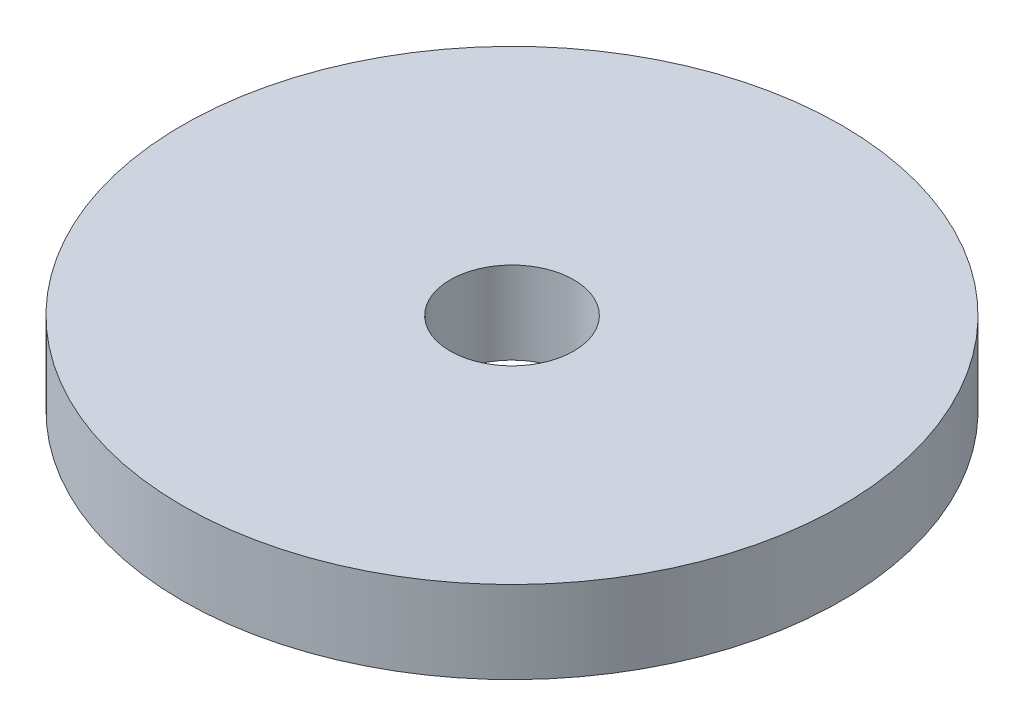
ISO-10303-21;
HEADER;
FILE_DESCRIPTION(('STEP AP214'),'2;1');
FILE_NAME('part.step','',(''),(''),'','','');
FILE_SCHEMA(('AUTOMOTIVE_DESIGN { 1 0 10303 214 1 1 1 1 }'));
ENDSEC;
DATA;
#1=APPLICATION_CONTEXT('core data for automotive mechanical design processes');
#2=APPLICATION_PROTOCOL_DEFINITION('international standard','automotive_design',2000,#1);
#3=PRODUCT_CONTEXT('',#1,'mechanical');
#4=PRODUCT('Part','Part','',(#3));
#5=PRODUCT_RELATED_PRODUCT_CATEGORY('part','',(#4));
#6=PRODUCT_DEFINITION_FORMATION('','',#4);
#7=PRODUCT_DEFINITION_CONTEXT('part definition',#1,'design');
#8=PRODUCT_DEFINITION('design','',#6,#7);
#9=PRODUCT_DEFINITION_SHAPE('','',#8);
#10=(LENGTH_UNIT() NAMED_UNIT(*) SI_UNIT(.MILLI.,.METRE.));
#11=(NAMED_UNIT(*) PLANE_ANGLE_UNIT() SI_UNIT($,.RADIAN.));
#12=(NAMED_UNIT(*) SI_UNIT($,.STERADIAN.) SOLID_ANGLE_UNIT());
#13=UNCERTAINTY_MEASURE_WITH_UNIT(LENGTH_MEASURE(1.E-05),#10,'distance_accuracy_value','');
#14=(GEOMETRIC_REPRESENTATION_CONTEXT(3) GLOBAL_UNCERTAINTY_ASSIGNED_CONTEXT((#13)) GLOBAL_UNIT_ASSIGNED_CONTEXT((#10,
#11,#12)) REPRESENTATION_CONTEXT('',''));
#15=CARTESIAN_POINT('',(0.,0.,0.));
#16=DIRECTION('',(0.,0.,1.));
#17=DIRECTION('',(1.,0.,0.));
#18=AXIS2_PLACEMENT_3D('',#15,#16,#17);
#19=CARTESIAN_POINT('',(0.,12.7,0.));
#20=DIRECTION('',(0.,1.,0.));
#21=DIRECTION('',(0.,0.,1.));
#22=AXIS2_PLACEMENT_3D('',#19,#20,#21);
#23=PLANE('',#22);
#24=CARTESIAN_POINT('',(0.,12.7,0.));
#25=DIRECTION('',(0.,1.,0.));
#26=DIRECTION('',(0.,0.,1.));
#27=AXIS2_PLACEMENT_3D('',#24,#25,#26);
#28=CIRCLE('',#27,50.8);
#29=CARTESIAN_POINT('',(0.,12.7,50.8));
#30=VERTEX_POINT('',#29);
#31=EDGE_CURVE('E10',#30,#30,#28,.T.);
#32=ORIENTED_EDGE('',*,*,#31,.T.);
#33=EDGE_LOOP('',(#32));
#34=FACE_BOUND('',#33,.T.);
#35=CARTESIAN_POINT('',(0.,12.7,0.));
#36=DIRECTION('',(0.,1.,0.));
#37=DIRECTION('',(0.,0.,1.));
#38=AXIS2_PLACEMENT_3D('',#35,#36,#37);
#39=CIRCLE('',#38,9.525);
#40=CARTESIAN_POINT('',(0.,12.7,9.525));
#41=VERTEX_POINT('',#40);
#42=EDGE_CURVE('E41',#41,#41,#39,.T.);
#43=ORIENTED_EDGE('',*,*,#42,.F.);
#44=EDGE_LOOP('',(#43));
#45=FACE_BOUND('',#44,.T.);
#46=ADVANCED_FACE('F30',(#34,#45),#23,.T.);
#47=CARTESIAN_POINT('',(0.,0.,0.));
#48=DIRECTION('',(0.,1.,0.));
#49=DIRECTION('',(0.,0.,1.));
#50=AXIS2_PLACEMENT_3D('',#47,#48,#49);
#51=PLANE('',#50);
#52=CARTESIAN_POINT('',(0.,0.,0.));
#53=DIRECTION('',(0.,1.,0.));
#54=DIRECTION('',(0.,0.,1.));
#55=AXIS2_PLACEMENT_3D('',#52,#53,#54);
#56=CIRCLE('',#55,50.8);
#57=CARTESIAN_POINT('',(0.,0.,50.8));
#58=VERTEX_POINT('',#57);
#59=EDGE_CURVE('E34',#58,#58,#56,.T.);
#60=ORIENTED_EDGE('',*,*,#59,.F.);
#61=EDGE_LOOP('',(#60));
#62=FACE_BOUND('',#61,.T.);
#63=CARTESIAN_POINT('',(0.,0.,0.));
#64=DIRECTION('',(0.,1.,0.));
#65=DIRECTION('',(0.,0.,1.));
#66=AXIS2_PLACEMENT_3D('',#63,#64,#65);
#67=CIRCLE('',#66,9.525);
#68=CARTESIAN_POINT('',(0.,0.,9.525));
#69=VERTEX_POINT('',#68);
#70=EDGE_CURVE('E43',#69,#69,#67,.T.);
#71=ORIENTED_EDGE('',*,*,#70,.T.);
#72=EDGE_LOOP('',(#71));
#73=FACE_BOUND('',#72,.T.);
#74=ADVANCED_FACE('F53',(#62,#73),#51,.F.);
#75=CARTESIAN_POINT('',(0.,12.7,0.));
#76=DIRECTION('',(0.,-1.,0.));
#77=DIRECTION('',(0.,0.,-1.));
#78=AXIS2_PLACEMENT_3D('',#75,#76,#77);
#79=CYLINDRICAL_SURFACE('',#78,50.8);
#80=ORIENTED_EDGE('',*,*,#31,.F.);
#81=EDGE_LOOP('',(#80));
#82=FACE_BOUND('',#81,.T.);
#83=ORIENTED_EDGE('',*,*,#59,.T.);
#84=EDGE_LOOP('',(#83));
#85=FACE_BOUND('',#84,.T.);
#86=ADVANCED_FACE('F32',(#82,#85),#79,.T.);
#87=CARTESIAN_POINT('',(0.,12.7,0.));
#88=DIRECTION('',(0.,-1.,0.));
#89=DIRECTION('',(0.,0.,-1.));
#90=AXIS2_PLACEMENT_3D('',#87,#88,#89);
#91=CYLINDRICAL_SURFACE('',#90,9.525);
#92=ORIENTED_EDGE('',*,*,#42,.T.);
#93=EDGE_LOOP('',(#92));
#94=FACE_BOUND('',#93,.T.);
#95=ORIENTED_EDGE('',*,*,#70,.F.);
#96=EDGE_LOOP('',(#95));
#97=FACE_BOUND('',#96,.T.);
#98=ADVANCED_FACE('F49',(#94,#97),#91,.F.);
#99=CLOSED_SHELL('',(#46,#74,#86,#98));
#100=MANIFOLD_SOLID_BREP('B2',#99);
#101=ADVANCED_BREP_SHAPE_REPRESENTATION('',(#18,#100),#14);
#102=SHAPE_DEFINITION_REPRESENTATION(#9,#101);
ENDSEC;
END-ISO-10303-21;
